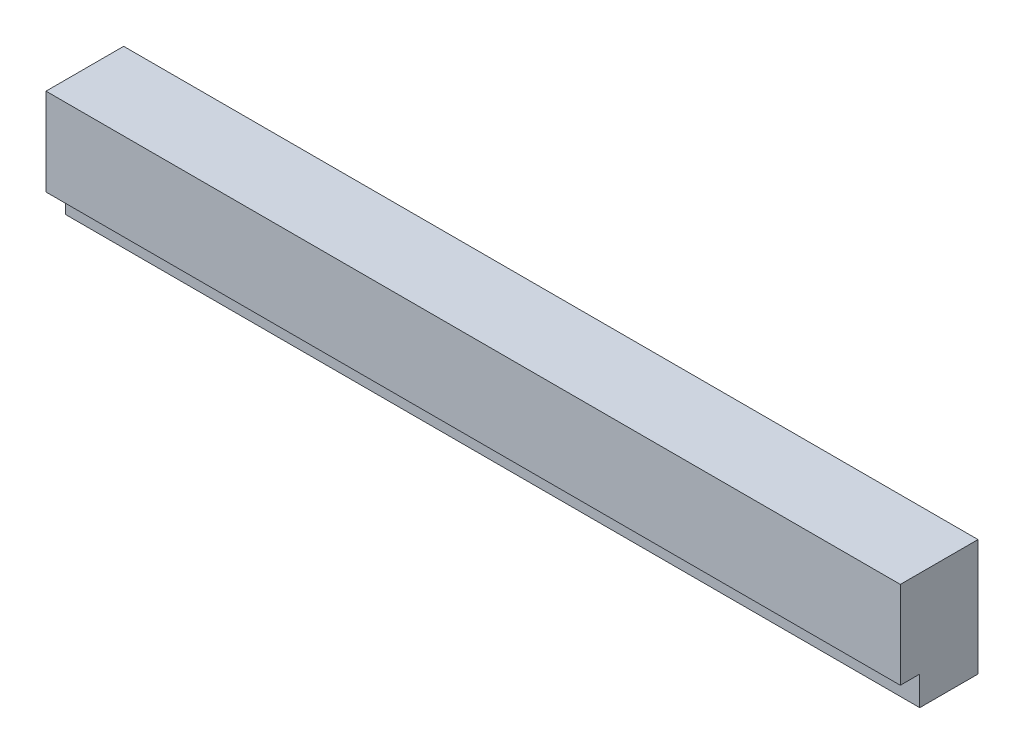
ISO-10303-21;
HEADER;
FILE_DESCRIPTION(('STEP AP214'),'2;1');
FILE_NAME('part.step','',(''),(''),'','','');
FILE_SCHEMA(('AUTOMOTIVE_DESIGN { 1 0 10303 214 1 1 1 1 }'));
ENDSEC;
DATA;
#1=APPLICATION_CONTEXT('core data for automotive mechanical design processes');
#2=APPLICATION_PROTOCOL_DEFINITION('international standard','automotive_design',2000,#1);
#3=PRODUCT_CONTEXT('',#1,'mechanical');
#4=PRODUCT('Part','Part','',(#3));
#5=PRODUCT_RELATED_PRODUCT_CATEGORY('part','',(#4));
#6=PRODUCT_DEFINITION_FORMATION('','',#4);
#7=PRODUCT_DEFINITION_CONTEXT('part definition',#1,'design');
#8=PRODUCT_DEFINITION('design','',#6,#7);
#9=PRODUCT_DEFINITION_SHAPE('','',#8);
#10=(LENGTH_UNIT() NAMED_UNIT(*) SI_UNIT(.MILLI.,.METRE.));
#11=(NAMED_UNIT(*) PLANE_ANGLE_UNIT() SI_UNIT($,.RADIAN.));
#12=(NAMED_UNIT(*) SI_UNIT($,.STERADIAN.) SOLID_ANGLE_UNIT());
#13=UNCERTAINTY_MEASURE_WITH_UNIT(LENGTH_MEASURE(1.E-05),#10,'distance_accuracy_value','');
#14=(GEOMETRIC_REPRESENTATION_CONTEXT(3) GLOBAL_UNCERTAINTY_ASSIGNED_CONTEXT((#13)) GLOBAL_UNIT_ASSIGNED_CONTEXT((#10,
#11,#12)) REPRESENTATION_CONTEXT('',''));
#15=CARTESIAN_POINT('',(0.,0.,0.));
#16=DIRECTION('',(0.,0.,1.));
#17=DIRECTION('',(1.,0.,0.));
#18=AXIS2_PLACEMENT_3D('',#15,#16,#17);
#19=CARTESIAN_POINT('',(440.,120.,-40.));
#20=DIRECTION('',(-1.,0.,0.));
#21=DIRECTION('',(0.,0.,1.));
#22=AXIS2_PLACEMENT_3D('',#19,#20,#21);
#23=PLANE('',#22);
#24=DIRECTION('',(0.,-1.,0.));
#25=VECTOR('',#24,1.);
#26=CARTESIAN_POINT('',(440.,120.,40.));
#27=LINE('',#26,#25);
#28=CARTESIAN_POINT('',(440.,120.,40.));
#29=VERTEX_POINT('',#28);
#30=CARTESIAN_POINT('',(440.,30.,40.));
#31=VERTEX_POINT('',#30);
#32=EDGE_CURVE('E117',#29,#31,#27,.T.);
#33=ORIENTED_EDGE('',*,*,#32,.T.);
#34=DIRECTION('',(0.,0.,1.));
#35=VECTOR('',#34,1.);
#36=CARTESIAN_POINT('',(440.,30.,40.));
#37=LINE('',#36,#35);
#38=CARTESIAN_POINT('',(440.,30.,20.));
#39=VERTEX_POINT('',#38);
#40=EDGE_CURVE('E103',#39,#31,#37,.T.);
#41=ORIENTED_EDGE('',*,*,#40,.F.);
#42=DIRECTION('',(0.,1.,0.));
#43=VECTOR('',#42,1.);
#44=CARTESIAN_POINT('',(440.,0.,20.));
#45=LINE('',#44,#43);
#46=CARTESIAN_POINT('',(440.,0.,20.));
#47=VERTEX_POINT('',#46);
#48=EDGE_CURVE('E93',#47,#39,#45,.T.);
#49=ORIENTED_EDGE('',*,*,#48,.F.);
#50=DIRECTION('',(0.,0.,-1.));
#51=VECTOR('',#50,1.);
#52=CARTESIAN_POINT('',(440.,0.,-40.));
#53=LINE('',#52,#51);
#54=CARTESIAN_POINT('',(440.,0.,-40.));
#55=VERTEX_POINT('',#54);
#56=EDGE_CURVE('E102',#47,#55,#53,.T.);
#57=ORIENTED_EDGE('',*,*,#56,.T.);
#58=DIRECTION('',(0.,-1.,0.));
#59=VECTOR('',#58,1.);
#60=CARTESIAN_POINT('',(440.,120.,-40.));
#61=LINE('',#60,#59);
#62=CARTESIAN_POINT('',(440.,120.,-40.));
#63=VERTEX_POINT('',#62);
#64=EDGE_CURVE('E40',#63,#55,#61,.T.);
#65=ORIENTED_EDGE('',*,*,#64,.F.);
#66=DIRECTION('',(0.,0.,-1.));
#67=VECTOR('',#66,1.);
#68=CARTESIAN_POINT('',(440.,120.,-40.));
#69=LINE('',#68,#67);
#70=EDGE_CURVE('E116',#29,#63,#69,.T.);
#71=ORIENTED_EDGE('',*,*,#70,.F.);
#72=EDGE_LOOP('',(#33,#41,#49,#57,#65,#71));
#73=FACE_BOUND('',#72,.T.);
#74=ADVANCED_FACE('F33',(#73),#23,.F.);
#75=CARTESIAN_POINT('',(-440.,120.,-39.9999999999999));
#76=DIRECTION('',(0.,0.,1.));
#77=DIRECTION('',(1.,0.,0.));
#78=AXIS2_PLACEMENT_3D('',#75,#76,#77);
#79=PLANE('',#78);
#80=DIRECTION('',(-1.,0.,0.));
#81=VECTOR('',#80,1.);
#82=CARTESIAN_POINT('',(-440.,0.,-39.9999999999999));
#83=LINE('',#82,#81);
#84=CARTESIAN_POINT('',(-440.,0.,-39.9999999999999));
#85=VERTEX_POINT('',#84);
#86=EDGE_CURVE('E71',#55,#85,#83,.T.);
#87=ORIENTED_EDGE('',*,*,#86,.T.);
#88=DIRECTION('',(0.,-1.,0.));
#89=VECTOR('',#88,1.);
#90=CARTESIAN_POINT('',(-440.,120.,-39.9999999999999));
#91=LINE('',#90,#89);
#92=CARTESIAN_POINT('',(-440.,120.,-39.9999999999999));
#93=VERTEX_POINT('',#92);
#94=EDGE_CURVE('E122',#93,#85,#91,.T.);
#95=ORIENTED_EDGE('',*,*,#94,.F.);
#96=DIRECTION('',(-1.,0.,0.));
#97=VECTOR('',#96,1.);
#98=CARTESIAN_POINT('',(-440.,120.,-39.9999999999999));
#99=LINE('',#98,#97);
#100=EDGE_CURVE('E76',#63,#93,#99,.T.);
#101=ORIENTED_EDGE('',*,*,#100,.F.);
#102=ORIENTED_EDGE('',*,*,#64,.T.);
#103=EDGE_LOOP('',(#87,#95,#101,#102));
#104=FACE_BOUND('',#103,.T.);
#105=ADVANCED_FACE('F123',(#104),#79,.F.);
#106=CARTESIAN_POINT('',(-440.,120.,-39.9999999999999));
#107=DIRECTION('',(1.,0.,0.));
#108=DIRECTION('',(0.,0.,-1.));
#109=AXIS2_PLACEMENT_3D('',#106,#107,#108);
#110=PLANE('',#109);
#111=DIRECTION('',(0.,1.,0.));
#112=VECTOR('',#111,1.);
#113=CARTESIAN_POINT('',(-440.,120.,20.));
#114=LINE('',#113,#112);
#115=CARTESIAN_POINT('',(-440.,0.,20.));
#116=VERTEX_POINT('',#115);
#117=CARTESIAN_POINT('',(-440.,30.,20.));
#118=VERTEX_POINT('',#117);
#119=EDGE_CURVE('E47',#116,#118,#114,.T.);
#120=ORIENTED_EDGE('',*,*,#119,.T.);
#121=DIRECTION('',(0.,0.,1.));
#122=VECTOR('',#121,1.);
#123=CARTESIAN_POINT('',(-440.,30.,-39.9999999999999));
#124=LINE('',#123,#122);
#125=CARTESIAN_POINT('',(-440.,30.,40.));
#126=VERTEX_POINT('',#125);
#127=EDGE_CURVE('E106',#118,#126,#124,.T.);
#128=ORIENTED_EDGE('',*,*,#127,.T.);
#129=DIRECTION('',(0.,-1.,0.));
#130=VECTOR('',#129,1.);
#131=CARTESIAN_POINT('',(-440.,120.,40.0000000000001));
#132=LINE('',#131,#130);
#133=CARTESIAN_POINT('',(-440.,120.,40.0000000000001));
#134=VERTEX_POINT('',#133);
#135=EDGE_CURVE('E119',#134,#126,#132,.T.);
#136=ORIENTED_EDGE('',*,*,#135,.F.);
#137=DIRECTION('',(0.,0.,1.));
#138=VECTOR('',#137,1.);
#139=CARTESIAN_POINT('',(-440.,120.,-39.9999999999999));
#140=LINE('',#139,#138);
#141=EDGE_CURVE('E126',#93,#134,#140,.T.);
#142=ORIENTED_EDGE('',*,*,#141,.F.);
#143=ORIENTED_EDGE('',*,*,#94,.T.);
#144=DIRECTION('',(0.,0.,1.));
#145=VECTOR('',#144,1.);
#146=CARTESIAN_POINT('',(-440.,0.,-39.9999999999999));
#147=LINE('',#146,#145);
#148=EDGE_CURVE('E108',#85,#116,#147,.T.);
#149=ORIENTED_EDGE('',*,*,#148,.T.);
#150=EDGE_LOOP('',(#120,#128,#136,#142,#143,#149));
#151=FACE_BOUND('',#150,.T.);
#152=ADVANCED_FACE('F133',(#151),#110,.F.);
#153=CARTESIAN_POINT('',(-440.,120.,40.0000000000001));
#154=DIRECTION('',(0.,0.,-1.));
#155=DIRECTION('',(-1.,0.,0.));
#156=AXIS2_PLACEMENT_3D('',#153,#154,#155);
#157=PLANE('',#156);
#158=ORIENTED_EDGE('',*,*,#135,.T.);
#159=DIRECTION('',(1.,0.,0.));
#160=VECTOR('',#159,1.);
#161=CARTESIAN_POINT('',(-627.,30.,40.));
#162=LINE('',#161,#160);
#163=EDGE_CURVE('E137',#126,#31,#162,.T.);
#164=ORIENTED_EDGE('',*,*,#163,.T.);
#165=ORIENTED_EDGE('',*,*,#32,.F.);
#166=DIRECTION('',(1.,0.,0.));
#167=VECTOR('',#166,1.);
#168=CARTESIAN_POINT('',(-440.,120.,40.0000000000001));
#169=LINE('',#168,#167);
#170=EDGE_CURVE('E55',#134,#29,#169,.T.);
#171=ORIENTED_EDGE('',*,*,#170,.F.);
#172=EDGE_LOOP('',(#158,#164,#165,#171));
#173=FACE_BOUND('',#172,.T.);
#174=ADVANCED_FACE('F136',(#173),#157,.F.);
#175=CARTESIAN_POINT('',(0.,120.,0.));
#176=DIRECTION('',(0.,1.,0.));
#177=DIRECTION('',(0.,0.,1.));
#178=AXIS2_PLACEMENT_3D('',#175,#176,#177);
#179=PLANE('',#178);
#180=ORIENTED_EDGE('',*,*,#70,.T.);
#181=ORIENTED_EDGE('',*,*,#100,.T.);
#182=ORIENTED_EDGE('',*,*,#141,.T.);
#183=ORIENTED_EDGE('',*,*,#170,.T.);
#184=EDGE_LOOP('',(#180,#181,#182,#183));
#185=FACE_BOUND('',#184,.T.);
#186=ADVANCED_FACE('F131',(#185),#179,.T.);
#187=CARTESIAN_POINT('',(0.,0.,0.));
#188=DIRECTION('',(0.,1.,0.));
#189=DIRECTION('',(0.,0.,1.));
#190=AXIS2_PLACEMENT_3D('',#187,#188,#189);
#191=PLANE('',#190);
#192=ORIENTED_EDGE('',*,*,#56,.F.);
#193=DIRECTION('',(-1.,0.,0.));
#194=VECTOR('',#193,1.);
#195=CARTESIAN_POINT('',(0.,0.,20.));
#196=LINE('',#195,#194);
#197=EDGE_CURVE('E11',#47,#116,#196,.T.);
#198=ORIENTED_EDGE('',*,*,#197,.T.);
#199=ORIENTED_EDGE('',*,*,#148,.F.);
#200=ORIENTED_EDGE('',*,*,#86,.F.);
#201=EDGE_LOOP('',(#192,#198,#199,#200));
#202=FACE_BOUND('',#201,.T.);
#203=ADVANCED_FACE('F105',(#202),#191,.F.);
#204=CARTESIAN_POINT('',(-627.,30.,40.));
#205=DIRECTION('',(0.,1.,0.));
#206=DIRECTION('',(0.,0.,1.));
#207=AXIS2_PLACEMENT_3D('',#204,#205,#206);
#208=PLANE('',#207);
#209=DIRECTION('',(1.,0.,0.));
#210=VECTOR('',#209,1.);
#211=CARTESIAN_POINT('',(-627.,30.,20.));
#212=LINE('',#211,#210);
#213=EDGE_CURVE('E139',#118,#39,#212,.T.);
#214=ORIENTED_EDGE('',*,*,#213,.T.);
#215=ORIENTED_EDGE('',*,*,#40,.T.);
#216=ORIENTED_EDGE('',*,*,#163,.F.);
#217=ORIENTED_EDGE('',*,*,#127,.F.);
#218=EDGE_LOOP('',(#214,#215,#216,#217));
#219=FACE_BOUND('',#218,.T.);
#220=ADVANCED_FACE('F143',(#219),#208,.F.);
#221=CARTESIAN_POINT('',(-627.,0.,20.));
#222=DIRECTION('',(0.,0.,-1.));
#223=DIRECTION('',(-1.,0.,0.));
#224=AXIS2_PLACEMENT_3D('',#221,#222,#223);
#225=PLANE('',#224);
#226=ORIENTED_EDGE('',*,*,#197,.F.);
#227=ORIENTED_EDGE('',*,*,#48,.T.);
#228=ORIENTED_EDGE('',*,*,#213,.F.);
#229=ORIENTED_EDGE('',*,*,#119,.F.);
#230=EDGE_LOOP('',(#226,#227,#228,#229));
#231=FACE_BOUND('',#230,.T.);
#232=ADVANCED_FACE('F92',(#231),#225,.F.);
#233=CLOSED_SHELL('',(#74,#105,#152,#174,#186,#203,#220,#232));
#234=MANIFOLD_SOLID_BREP('B2',#233);
#235=ADVANCED_BREP_SHAPE_REPRESENTATION('',(#18,#234),#14);
#236=SHAPE_DEFINITION_REPRESENTATION(#9,#235);
ENDSEC;
END-ISO-10303-21;
